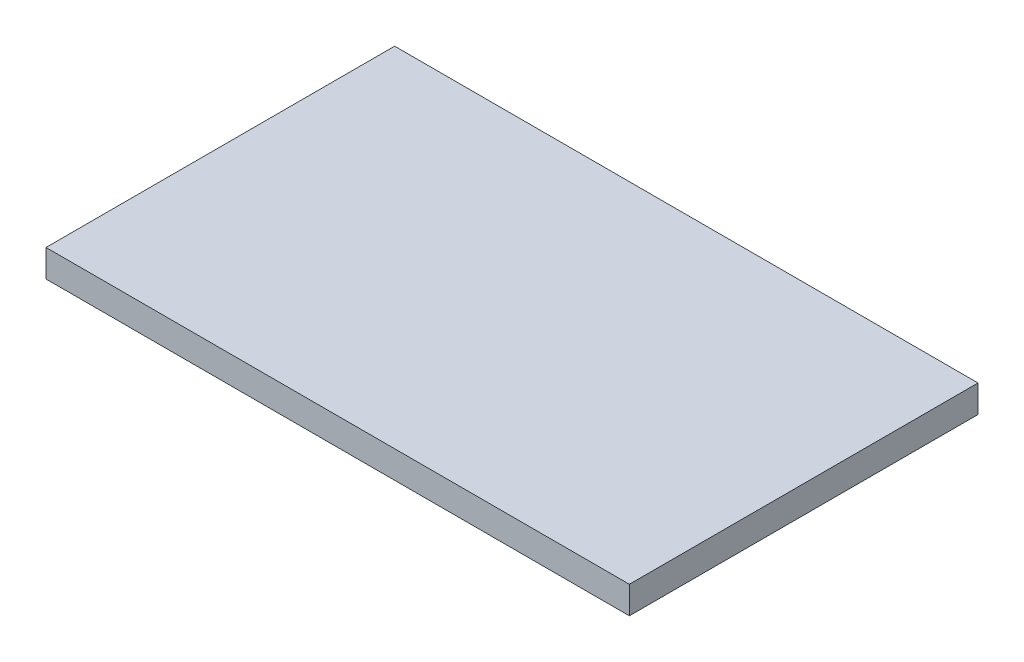
ISO-10303-21;
HEADER;
FILE_DESCRIPTION(('STEP AP214'),'2;1');
FILE_NAME('part.step','',(''),(''),'','','');
FILE_SCHEMA(('AUTOMOTIVE_DESIGN { 1 0 10303 214 1 1 1 1 }'));
ENDSEC;
DATA;
#1=APPLICATION_CONTEXT('core data for automotive mechanical design processes');
#2=APPLICATION_PROTOCOL_DEFINITION('international standard','automotive_design',2000,#1);
#3=PRODUCT_CONTEXT('',#1,'mechanical');
#4=PRODUCT('Part','Part','',(#3));
#5=PRODUCT_RELATED_PRODUCT_CATEGORY('part','',(#4));
#6=PRODUCT_DEFINITION_FORMATION('','',#4);
#7=PRODUCT_DEFINITION_CONTEXT('part definition',#1,'design');
#8=PRODUCT_DEFINITION('design','',#6,#7);
#9=PRODUCT_DEFINITION_SHAPE('','',#8);
#10=(LENGTH_UNIT() NAMED_UNIT(*) SI_UNIT(.MILLI.,.METRE.));
#11=(NAMED_UNIT(*) PLANE_ANGLE_UNIT() SI_UNIT($,.RADIAN.));
#12=(NAMED_UNIT(*) SI_UNIT($,.STERADIAN.) SOLID_ANGLE_UNIT());
#13=UNCERTAINTY_MEASURE_WITH_UNIT(LENGTH_MEASURE(1.E-05),#10,'distance_accuracy_value','');
#14=(GEOMETRIC_REPRESENTATION_CONTEXT(3) GLOBAL_UNCERTAINTY_ASSIGNED_CONTEXT((#13)) GLOBAL_UNIT_ASSIGNED_CONTEXT((#10,
#11,#12)) REPRESENTATION_CONTEXT('',''));
#15=CARTESIAN_POINT('',(0.,0.,0.));
#16=DIRECTION('',(0.,0.,1.));
#17=DIRECTION('',(1.,0.,0.));
#18=AXIS2_PLACEMENT_3D('',#15,#16,#17);
#19=CARTESIAN_POINT('',(25.6,2.4,0.));
#20=DIRECTION('',(-1.,0.,0.));
#21=DIRECTION('',(0.,0.,1.));
#22=AXIS2_PLACEMENT_3D('',#19,#20,#21);
#23=PLANE('',#22);
#24=DIRECTION('',(0.,0.,-1.));
#25=VECTOR('',#24,1.);
#26=CARTESIAN_POINT('',(25.6,0.,0.));
#27=LINE('',#26,#25);
#28=CARTESIAN_POINT('',(25.6,0.,14.1));
#29=VERTEX_POINT('',#28);
#30=CARTESIAN_POINT('',(25.6,0.,-16.5));
#31=VERTEX_POINT('',#30);
#32=EDGE_CURVE('E99',#29,#31,#27,.T.);
#33=ORIENTED_EDGE('',*,*,#32,.T.);
#34=DIRECTION('',(0.,-1.,0.));
#35=VECTOR('',#34,1.);
#36=CARTESIAN_POINT('',(25.6,2.4,-16.5));
#37=LINE('',#36,#35);
#38=CARTESIAN_POINT('',(25.6,2.4,-16.5));
#39=VERTEX_POINT('',#38);
#40=EDGE_CURVE('E11',#39,#31,#37,.T.);
#41=ORIENTED_EDGE('',*,*,#40,.F.);
#42=DIRECTION('',(0.,0.,-1.));
#43=VECTOR('',#42,1.);
#44=CARTESIAN_POINT('',(25.6,2.4,0.));
#45=LINE('',#44,#43);
#46=CARTESIAN_POINT('',(25.6,2.4,14.1));
#47=VERTEX_POINT('',#46);
#48=EDGE_CURVE('E76',#47,#39,#45,.T.);
#49=ORIENTED_EDGE('',*,*,#48,.F.);
#50=DIRECTION('',(0.,-1.,0.));
#51=VECTOR('',#50,1.);
#52=CARTESIAN_POINT('',(25.6,2.4,14.1));
#53=LINE('',#52,#51);
#54=EDGE_CURVE('E95',#47,#29,#53,.T.);
#55=ORIENTED_EDGE('',*,*,#54,.T.);
#56=EDGE_LOOP('',(#33,#41,#49,#55));
#57=FACE_BOUND('',#56,.T.);
#58=ADVANCED_FACE('F37',(#57),#23,.F.);
#59=CARTESIAN_POINT('',(0.,2.4,-16.5));
#60=DIRECTION('',(0.,0.,-1.));
#61=DIRECTION('',(-1.,0.,0.));
#62=AXIS2_PLACEMENT_3D('',#59,#60,#61);
#63=PLANE('',#62);
#64=DIRECTION('',(1.,0.,0.));
#65=VECTOR('',#64,1.);
#66=CARTESIAN_POINT('',(0.,0.,-16.5));
#67=LINE('',#66,#65);
#68=CARTESIAN_POINT('',(-25.6,0.,-16.5));
#69=VERTEX_POINT('',#68);
#70=EDGE_CURVE('E85',#69,#31,#67,.T.);
#71=ORIENTED_EDGE('',*,*,#70,.F.);
#72=DIRECTION('',(0.,-1.,0.));
#73=VECTOR('',#72,1.);
#74=CARTESIAN_POINT('',(-25.6,2.4,-16.5));
#75=LINE('',#74,#73);
#76=CARTESIAN_POINT('',(-25.6,2.4,-16.5));
#77=VERTEX_POINT('',#76);
#78=EDGE_CURVE('E45',#77,#69,#75,.T.);
#79=ORIENTED_EDGE('',*,*,#78,.F.);
#80=DIRECTION('',(1.,0.,0.));
#81=VECTOR('',#80,1.);
#82=CARTESIAN_POINT('',(0.,2.4,-16.5));
#83=LINE('',#82,#81);
#84=EDGE_CURVE('E83',#77,#39,#83,.T.);
#85=ORIENTED_EDGE('',*,*,#84,.T.);
#86=ORIENTED_EDGE('',*,*,#40,.T.);
#87=EDGE_LOOP('',(#71,#79,#85,#86));
#88=FACE_BOUND('',#87,.T.);
#89=ADVANCED_FACE('F82',(#88),#63,.T.);
#90=CARTESIAN_POINT('',(-25.6,2.4,0.));
#91=DIRECTION('',(-1.,0.,0.));
#92=DIRECTION('',(0.,0.,1.));
#93=AXIS2_PLACEMENT_3D('',#90,#91,#92);
#94=PLANE('',#93);
#95=DIRECTION('',(0.,0.,-1.));
#96=VECTOR('',#95,1.);
#97=CARTESIAN_POINT('',(-25.6,0.,0.));
#98=LINE('',#97,#96);
#99=CARTESIAN_POINT('',(-25.6,0.,14.1));
#100=VERTEX_POINT('',#99);
#101=EDGE_CURVE('E103',#100,#69,#98,.T.);
#102=ORIENTED_EDGE('',*,*,#101,.F.);
#103=DIRECTION('',(0.,-1.,0.));
#104=VECTOR('',#103,1.);
#105=CARTESIAN_POINT('',(-25.6,2.4,14.1));
#106=LINE('',#105,#104);
#107=CARTESIAN_POINT('',(-25.6,2.4,14.1));
#108=VERTEX_POINT('',#107);
#109=EDGE_CURVE('E68',#108,#100,#106,.T.);
#110=ORIENTED_EDGE('',*,*,#109,.F.);
#111=DIRECTION('',(0.,0.,-1.));
#112=VECTOR('',#111,1.);
#113=CARTESIAN_POINT('',(-25.6,2.4,0.));
#114=LINE('',#113,#112);
#115=EDGE_CURVE('E91',#108,#77,#114,.T.);
#116=ORIENTED_EDGE('',*,*,#115,.T.);
#117=ORIENTED_EDGE('',*,*,#78,.T.);
#118=EDGE_LOOP('',(#102,#110,#116,#117));
#119=FACE_BOUND('',#118,.T.);
#120=ADVANCED_FACE('F93',(#119),#94,.T.);
#121=CARTESIAN_POINT('',(0.,2.4,14.1));
#122=DIRECTION('',(0.,0.,-1.));
#123=DIRECTION('',(-1.,0.,0.));
#124=AXIS2_PLACEMENT_3D('',#121,#122,#123);
#125=PLANE('',#124);
#126=DIRECTION('',(1.,0.,0.));
#127=VECTOR('',#126,1.);
#128=CARTESIAN_POINT('',(0.,0.,14.1));
#129=LINE('',#128,#127);
#130=EDGE_CURVE('E71',#100,#29,#129,.T.);
#131=ORIENTED_EDGE('',*,*,#130,.T.);
#132=ORIENTED_EDGE('',*,*,#54,.F.);
#133=DIRECTION('',(1.,0.,0.));
#134=VECTOR('',#133,1.);
#135=CARTESIAN_POINT('',(0.,2.4,14.1));
#136=LINE('',#135,#134);
#137=EDGE_CURVE('E53',#108,#47,#136,.T.);
#138=ORIENTED_EDGE('',*,*,#137,.F.);
#139=ORIENTED_EDGE('',*,*,#109,.T.);
#140=EDGE_LOOP('',(#131,#132,#138,#139));
#141=FACE_BOUND('',#140,.T.);
#142=ADVANCED_FACE('F116',(#141),#125,.F.);
#143=CARTESIAN_POINT('',(0.,2.4,0.));
#144=DIRECTION('',(0.,1.,0.));
#145=DIRECTION('',(0.,0.,1.));
#146=AXIS2_PLACEMENT_3D('',#143,#144,#145);
#147=PLANE('',#146);
#148=ORIENTED_EDGE('',*,*,#48,.T.);
#149=ORIENTED_EDGE('',*,*,#84,.F.);
#150=ORIENTED_EDGE('',*,*,#115,.F.);
#151=ORIENTED_EDGE('',*,*,#137,.T.);
#152=EDGE_LOOP('',(#148,#149,#150,#151));
#153=FACE_BOUND('',#152,.T.);
#154=ADVANCED_FACE('F90',(#153),#147,.T.);
#155=CARTESIAN_POINT('',(0.,0.,0.));
#156=DIRECTION('',(0.,1.,0.));
#157=DIRECTION('',(0.,0.,1.));
#158=AXIS2_PLACEMENT_3D('',#155,#156,#157);
#159=PLANE('',#158);
#160=ORIENTED_EDGE('',*,*,#32,.F.);
#161=ORIENTED_EDGE('',*,*,#130,.F.);
#162=ORIENTED_EDGE('',*,*,#101,.T.);
#163=ORIENTED_EDGE('',*,*,#70,.T.);
#164=EDGE_LOOP('',(#160,#161,#162,#163));
#165=FACE_BOUND('',#164,.T.);
#166=ADVANCED_FACE('F110',(#165),#159,.F.);
#167=CLOSED_SHELL('',(#58,#89,#120,#142,#154,#166));
#168=MANIFOLD_SOLID_BREP('B2',#167);
#169=ADVANCED_BREP_SHAPE_REPRESENTATION('',(#18,#168),#14);
#170=SHAPE_DEFINITION_REPRESENTATION(#9,#169);
ENDSEC;
END-ISO-10303-21;
